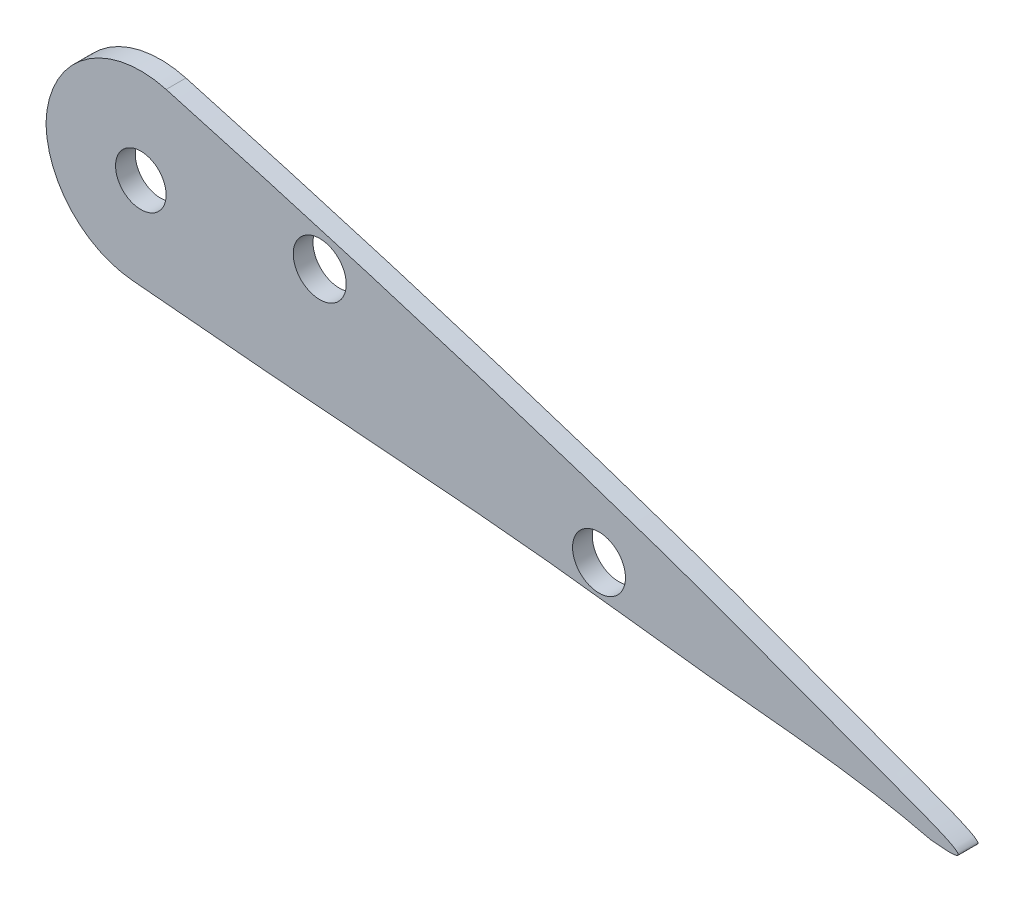
ISO-10303-21;
HEADER;
FILE_DESCRIPTION(('STEP AP214'),'2;1');
FILE_NAME('part.step','',(''),(''),'','','');
FILE_SCHEMA(('AUTOMOTIVE_DESIGN { 1 0 10303 214 1 1 1 1 }'));
ENDSEC;
DATA;
#1=APPLICATION_CONTEXT('core data for automotive mechanical design processes');
#2=APPLICATION_PROTOCOL_DEFINITION('international standard','automotive_design',2000,#1);
#3=PRODUCT_CONTEXT('',#1,'mechanical');
#4=PRODUCT('Part','Part','',(#3));
#5=PRODUCT_RELATED_PRODUCT_CATEGORY('part','',(#4));
#6=PRODUCT_DEFINITION_FORMATION('','',#4);
#7=PRODUCT_DEFINITION_CONTEXT('part definition',#1,'design');
#8=PRODUCT_DEFINITION('design','',#6,#7);
#9=PRODUCT_DEFINITION_SHAPE('','',#8);
#10=(LENGTH_UNIT() NAMED_UNIT(*) SI_UNIT(.MILLI.,.METRE.));
#11=(NAMED_UNIT(*) PLANE_ANGLE_UNIT() SI_UNIT($,.RADIAN.));
#12=(NAMED_UNIT(*) SI_UNIT($,.STERADIAN.) SOLID_ANGLE_UNIT());
#13=UNCERTAINTY_MEASURE_WITH_UNIT(LENGTH_MEASURE(1.E-05),#10,'distance_accuracy_value','');
#14=(GEOMETRIC_REPRESENTATION_CONTEXT(3) GLOBAL_UNCERTAINTY_ASSIGNED_CONTEXT((#13)) GLOBAL_UNIT_ASSIGNED_CONTEXT((#10,
#11,#12)) REPRESENTATION_CONTEXT('',''));
#15=CARTESIAN_POINT('',(0.,0.,0.));
#16=DIRECTION('',(0.,0.,1.));
#17=DIRECTION('',(1.,0.,0.));
#18=AXIS2_PLACEMENT_3D('',#15,#16,#17);
#19=CARTESIAN_POINT('',(0.000560351162113587,0.000130087070423624,1.5875));
#20=CARTESIAN_POINT('',(1.23071418869678,-6.92407609127206,1.5875));
#21=CARTESIAN_POINT('',(15.3166033306834,-6.18906584099094,1.5875));
#22=CARTESIAN_POINT('',(36.4546728163185,-6.09849990105009,1.5875));
#23=CARTESIAN_POINT('',(66.5061971849192,-0.586669106973501,1.5875));
#24=CARTESIAN_POINT('',(110.497331171581,6.18149522271792,1.5875));
#25=CARTESIAN_POINT('',(157.718638091679,9.03065014873911,1.5875));
#26=CARTESIAN_POINT('',(205.10142463584,8.83808028186313,1.5875));
#27=CARTESIAN_POINT('',(235.858814759408,7.87030619247826,1.5875));
#28=CARTESIAN_POINT('',(260.846344817159,5.42741339404395,1.5875));
#29=CARTESIAN_POINT('',(276.264022989737,4.51435670375389,1.5875));
#30=CARTESIAN_POINT('',(293.989507544058,2.09398731346533,1.5875));
#31=CARTESIAN_POINT('',(303.956832564589,1.47095520994628,1.5875));
#32=CARTESIAN_POINT('',(309.846313894505,0.000130087070423666,1.5875));
#33=B_SPLINE_CURVE_WITH_KNOTS('',3,(#19,#20,#21,#22,#23,#24,#25,#26,#27,#28,#29,#30,#31,#32),
.UNSPECIFIED.,.F.,.F.,(4,1,1,1,1,1,1,1,1,1,1,4),(0.,0.0569078595717698,0.106482711504673,
0.214488052979465,0.341297688349143,0.535095665520157,0.664680853556909,0.794660698192775,
0.828978881532905,0.904725108725214,0.942212919019968,1.),.UNSPECIFIED.);
#34=DIRECTION('',(0.,0.,-1.));
#35=VECTOR('',#34,1.);
#36=SURFACE_OF_LINEAR_EXTRUSION('',#33,#35);
#37=CARTESIAN_POINT('',(245.711534403114,6.85589995201886,1.5875));
#38=VERTEX_POINT('',#37);
#39=CARTESIAN_POINT('',(309.846313894505,0.000130087070423864,1.5875));
#40=VERTEX_POINT('',#39);
#41=EDGE_CURVE('E83',#38,#40,#33,.T.);
#42=ORIENTED_EDGE('',*,*,#41,.F.);
#43=DIRECTION('',(0.,0.,-1.));
#44=VECTOR('',#43,1.);
#45=CARTESIAN_POINT('',(245.711534403114,6.85589995201886,1.5875));
#46=LINE('',#45,#44);
#47=CARTESIAN_POINT('',(245.711534403114,6.85589995201886,0.));
#48=VERTEX_POINT('',#47);
#49=EDGE_CURVE('E103',#38,#48,#46,.T.);
#50=ORIENTED_EDGE('',*,*,#49,.T.);
#51=CARTESIAN_POINT('',(0.000560351162113587,0.000130087070423624,0.));
#52=CARTESIAN_POINT('',(1.23071418869678,-6.92407609127206,0.));
#53=CARTESIAN_POINT('',(15.3166033306834,-6.18906584099094,0.));
#54=CARTESIAN_POINT('',(36.4546728163185,-6.09849990105009,0.));
#55=CARTESIAN_POINT('',(66.5061971849192,-0.586669106973501,0.));
#56=CARTESIAN_POINT('',(110.497331171581,6.18149522271792,0.));
#57=CARTESIAN_POINT('',(157.718638091679,9.03065014873911,0.));
#58=CARTESIAN_POINT('',(205.10142463584,8.83808028186313,0.));
#59=CARTESIAN_POINT('',(235.858814759408,7.87030619247826,0.));
#60=CARTESIAN_POINT('',(260.846344817159,5.42741339404395,0.));
#61=CARTESIAN_POINT('',(276.264022989737,4.51435670375389,0.));
#62=CARTESIAN_POINT('',(293.989507544058,2.09398731346533,0.));
#63=CARTESIAN_POINT('',(303.956832564589,1.47095520994628,0.));
#64=CARTESIAN_POINT('',(309.846313894505,0.000130087070423666,0.));
#65=B_SPLINE_CURVE_WITH_KNOTS('',3,(#51,#52,#53,#54,#55,#56,#57,#58,#59,#60,#61,#62,#63,#64),
.UNSPECIFIED.,.F.,.F.,(4,1,1,1,1,1,1,1,1,1,1,4),(0.,0.0569078595717698,0.106482711504673,
0.214488052979465,0.341297688349143,0.535095665520157,0.664680853556909,0.794660698192775,
0.828978881532905,0.904725108725214,0.942212919019968,1.),.UNSPECIFIED.);
#66=CARTESIAN_POINT('',(309.846313894505,0.000130087070423864,0.));
#67=VERTEX_POINT('',#66);
#68=EDGE_CURVE('E100',#48,#67,#65,.T.);
#69=ORIENTED_EDGE('',*,*,#68,.T.);
#70=DIRECTION('',(0.,0.,-1.));
#71=VECTOR('',#70,1.);
#72=CARTESIAN_POINT('',(309.846313894505,0.000130087070423864,1.5875));
#73=LINE('',#72,#71);
#74=EDGE_CURVE('E96',#40,#67,#73,.T.);
#75=ORIENTED_EDGE('',*,*,#74,.F.);
#76=EDGE_LOOP('',(#42,#50,#69,#75));
#77=FACE_BOUND('',#76,.T.);
#78=ADVANCED_FACE('F41',(#77),#36,.F.);
#79=CARTESIAN_POINT('',(309.846313894505,0.000130087070423864,1.5875));
#80=CARTESIAN_POINT('',(314.816918223261,-0.51620674157964,1.5875));
#81=CARTESIAN_POINT('',(301.273197720551,4.38282813873556,1.5875));
#82=CARTESIAN_POINT('',(290.359837670022,8.71099439045776,1.5875));
#83=CARTESIAN_POINT('',(256.952064400645,19.5289209482833,1.5875));
#84=CARTESIAN_POINT('',(217.961060472083,29.6129748944238,1.5875));
#85=CARTESIAN_POINT('',(173.256699242147,40.0411042779434,1.5875));
#86=CARTESIAN_POINT('',(131.400792108858,47.8848319151037,1.5875));
#87=CARTESIAN_POINT('',(89.5976184754884,49.290763053775,1.5875));
#88=CARTESIAN_POINT('',(52.1111282710831,42.0692152748914,1.5875));
#89=CARTESIAN_POINT('',(26.2867198183782,29.9751763284633,1.5875));
#90=CARTESIAN_POINT('',(8.64909202481883,17.8566051741579,1.5875));
#91=CARTESIAN_POINT('',(0.810633126632263,7.35919605469637,1.5875));
#92=CARTESIAN_POINT('',(0.000560351162116727,0.000130087070423829,1.5875));
#93=B_SPLINE_CURVE_WITH_KNOTS('',3,(#79,#80,#81,#82,#83,#84,#85,#86,#87,#88,#89,#90,#91,#92),
.UNSPECIFIED.,.F.,.F.,(4,1,1,1,1,1,1,1,1,1,1,4),(0.,0.0239417713693992,0.070244030177139,
0.147561721425381,0.308455887006792,0.442387865106874,0.551517565626309,0.687091076796298,
0.811391258419108,0.886311735305172,0.939136382225768,1.),.UNSPECIFIED.);
#94=DIRECTION('',(0.,0.,-1.));
#95=VECTOR('',#94,1.);
#96=SURFACE_OF_LINEAR_EXTRUSION('',#93,#95);
#97=CARTESIAN_POINT('',(309.846313894505,0.000130087070423864,0.));
#98=CARTESIAN_POINT('',(314.816918223261,-0.51620674157964,0.));
#99=CARTESIAN_POINT('',(301.273197720551,4.38282813873556,0.));
#100=CARTESIAN_POINT('',(290.359837670022,8.71099439045776,0.));
#101=CARTESIAN_POINT('',(256.952064400645,19.5289209482833,0.));
#102=CARTESIAN_POINT('',(217.961060472083,29.6129748944238,0.));
#103=CARTESIAN_POINT('',(173.256699242147,40.0411042779434,0.));
#104=CARTESIAN_POINT('',(131.400792108858,47.8848319151037,0.));
#105=CARTESIAN_POINT('',(89.5976184754884,49.290763053775,0.));
#106=CARTESIAN_POINT('',(52.1111282710831,42.0692152748914,0.));
#107=CARTESIAN_POINT('',(26.2867198183782,29.9751763284633,0.));
#108=CARTESIAN_POINT('',(8.64909202481883,17.8566051741579,0.));
#109=CARTESIAN_POINT('',(0.810633126632263,7.35919605469637,0.));
#110=CARTESIAN_POINT('',(0.000560351162116727,0.000130087070423829,0.));
#111=B_SPLINE_CURVE_WITH_KNOTS('',3,(#97,#98,#99,#100,#101,#102,#103,#104,#105,#106,#107,#108,
#109,#110),.UNSPECIFIED.,.F.,.F.,(4,1,1,1,1,1,1,1,1,1,1,4),(0.,0.0239417713693992,
0.070244030177139,0.147561721425381,0.308455887006792,0.442387865106874,0.551517565626309,
0.687091076796298,0.811391258419108,0.886311735305172,0.939136382225768,1.),.UNSPECIFIED.);
#112=CARTESIAN_POINT('',(248.380487069027,21.5064277653464,0.));
#113=VERTEX_POINT('',#112);
#114=EDGE_CURVE('E92',#67,#113,#111,.T.);
#115=ORIENTED_EDGE('',*,*,#114,.T.);
#116=DIRECTION('',(0.,0.,-1.));
#117=VECTOR('',#116,1.);
#118=CARTESIAN_POINT('',(248.380487069024,21.5064277653472,0.));
#119=LINE('',#118,#117);
#120=CARTESIAN_POINT('',(248.380487069024,21.5064277653472,1.5875));
#121=VERTEX_POINT('',#120);
#122=EDGE_CURVE('E11',#113,#121,#119,.F.);
#123=ORIENTED_EDGE('',*,*,#122,.T.);
#124=EDGE_CURVE('E85',#40,#121,#93,.T.);
#125=ORIENTED_EDGE('',*,*,#124,.F.);
#126=ORIENTED_EDGE('',*,*,#74,.T.);
#127=EDGE_LOOP('',(#115,#123,#125,#126));
#128=FACE_BOUND('',#127,.T.);
#129=ADVANCED_FACE('F95',(#128),#96,.F.);
#130=CARTESIAN_POINT('',(153.387816973495,8.33338198857885,1.5875));
#131=DIRECTION('',(0.,0.,-1.));
#132=DIRECTION('',(-1.,0.,0.));
#133=AXIS2_PLACEMENT_3D('',#130,#131,#132);
#134=PLANE('',#133);
#135=CARTESIAN_POINT('',(260.720225154827,15.1781728449798,1.5875));
#136=DIRECTION('',(0.,0.,1.));
#137=DIRECTION('',(1.,0.,0.));
#138=AXIS2_PLACEMENT_3D('',#135,#136,#137);
#139=CIRCLE('',#138,2.12700000000001);
#140=CARTESIAN_POINT('',(262.847225154827,15.1781728449798,1.5875));
#141=VERTEX_POINT('',#140);
#142=EDGE_CURVE('E133',#141,#141,#139,.T.);
#143=ORIENTED_EDGE('',*,*,#142,.F.);
#144=EDGE_LOOP('',(#143));
#145=FACE_BOUND('',#144,.T.);
#146=CARTESIAN_POINT('',(283.157187456126,5.97779813190158,1.5875));
#147=DIRECTION('',(0.,0.,1.));
#148=DIRECTION('',(1.,0.,0.));
#149=AXIS2_PLACEMENT_3D('',#146,#147,#148);
#150=CIRCLE('',#149,2.12700000000001);
#151=CARTESIAN_POINT('',(285.284187456126,5.97779813190158,1.5875));
#152=VERTEX_POINT('',#151);
#153=EDGE_CURVE('E140',#152,#152,#150,.T.);
#154=ORIENTED_EDGE('',*,*,#153,.F.);
#155=EDGE_LOOP('',(#154));
#156=FACE_BOUND('',#155,.T.);
#157=CARTESIAN_POINT('',(246.346313894504,14.1629585922611,1.5875));
#158=DIRECTION('',(0.,0.,1.));
#159=DIRECTION('',(1.,0.,0.));
#160=AXIS2_PLACEMENT_3D('',#157,#158,#159);
#161=CIRCLE('',#160,2.03200000000001);
#162=CARTESIAN_POINT('',(248.378313894504,14.1629585922611,1.5875));
#163=VERTEX_POINT('',#162);
#164=EDGE_CURVE('E129',#163,#163,#161,.T.);
#165=ORIENTED_EDGE('',*,*,#164,.F.);
#166=EDGE_LOOP('',(#165));
#167=FACE_BOUND('',#166,.T.);
#168=CARTESIAN_POINT('',(246.346313894504,14.1629585922611,1.5875));
#169=DIRECTION('',(0.,0.,-1.));
#170=DIRECTION('',(-1.,0.,0.));
#171=AXIS2_PLACEMENT_3D('',#168,#169,#170);
#172=CIRCLE('',#171,7.62);
#173=CARTESIAN_POINT('',(238.727660087532,14.3061862763922,1.5875));
#174=VERTEX_POINT('',#173);
#175=EDGE_CURVE('E59',#121,#174,#172,.F.);
#176=ORIENTED_EDGE('',*,*,#175,.T.);
#177=CARTESIAN_POINT('',(246.346313894505,14.4494139605205,1.5875));
#178=DIRECTION('',(0.,0.,-1.));
#179=DIRECTION('',(-1.,0.,0.));
#180=AXIS2_PLACEMENT_3D('',#177,#178,#179);
#181=CIRCLE('',#180,7.62);
#182=EDGE_CURVE('E51',#174,#38,#181,.F.);
#183=ORIENTED_EDGE('',*,*,#182,.T.);
#184=ORIENTED_EDGE('',*,*,#41,.T.);
#185=ORIENTED_EDGE('',*,*,#124,.T.);
#186=EDGE_LOOP('',(#176,#183,#184,#185));
#187=FACE_BOUND('',#186,.T.);
#188=ADVANCED_FACE('F84',(#145,#156,#167,#187),#134,.F.);
#189=CARTESIAN_POINT('',(153.387816973495,8.33338198857885,0.));
#190=DIRECTION('',(0.,0.,-1.));
#191=DIRECTION('',(-1.,0.,0.));
#192=AXIS2_PLACEMENT_3D('',#189,#190,#191);
#193=PLANE('',#192);
#194=CARTESIAN_POINT('',(260.720225154827,15.1781728449798,0.));
#195=DIRECTION('',(0.,0.,-1.));
#196=DIRECTION('',(-1.,0.,0.));
#197=AXIS2_PLACEMENT_3D('',#194,#195,#196);
#198=CIRCLE('',#197,2.12700000000001);
#199=CARTESIAN_POINT('',(258.593225154827,15.1781728449798,0.));
#200=VERTEX_POINT('',#199);
#201=EDGE_CURVE('E45',#200,#200,#198,.T.);
#202=ORIENTED_EDGE('',*,*,#201,.F.);
#203=EDGE_LOOP('',(#202));
#204=FACE_BOUND('',#203,.T.);
#205=CARTESIAN_POINT('',(283.157187456126,5.97779813190158,0.));
#206=DIRECTION('',(0.,0.,-1.));
#207=DIRECTION('',(-1.,0.,0.));
#208=AXIS2_PLACEMENT_3D('',#205,#206,#207);
#209=CIRCLE('',#208,2.12700000000001);
#210=CARTESIAN_POINT('',(281.030187456126,5.97779813190158,0.));
#211=VERTEX_POINT('',#210);
#212=EDGE_CURVE('E130',#211,#211,#209,.T.);
#213=ORIENTED_EDGE('',*,*,#212,.F.);
#214=EDGE_LOOP('',(#213));
#215=FACE_BOUND('',#214,.T.);
#216=CARTESIAN_POINT('',(246.346313894504,14.1629585922611,0.));
#217=DIRECTION('',(0.,0.,-1.));
#218=DIRECTION('',(-1.,0.,0.));
#219=AXIS2_PLACEMENT_3D('',#216,#217,#218);
#220=CIRCLE('',#219,2.03200000000001);
#221=CARTESIAN_POINT('',(244.314313894504,14.1629585922611,0.));
#222=VERTEX_POINT('',#221);
#223=EDGE_CURVE('E126',#222,#222,#220,.T.);
#224=ORIENTED_EDGE('',*,*,#223,.F.);
#225=EDGE_LOOP('',(#224));
#226=FACE_BOUND('',#225,.T.);
#227=ORIENTED_EDGE('',*,*,#68,.F.);
#228=CARTESIAN_POINT('',(246.346313894505,14.4494139605205,0.));
#229=DIRECTION('',(0.,0.,-1.));
#230=DIRECTION('',(-1.,0.,0.));
#231=AXIS2_PLACEMENT_3D('',#228,#229,#230);
#232=CIRCLE('',#231,7.62);
#233=CARTESIAN_POINT('',(238.727660087532,14.3061862763922,0.));
#234=VERTEX_POINT('',#233);
#235=EDGE_CURVE('E115',#48,#234,#232,.T.);
#236=ORIENTED_EDGE('',*,*,#235,.T.);
#237=CARTESIAN_POINT('',(246.346313894504,14.1629585922611,0.));
#238=DIRECTION('',(0.,0.,-1.));
#239=DIRECTION('',(-1.,0.,0.));
#240=AXIS2_PLACEMENT_3D('',#237,#238,#239);
#241=CIRCLE('',#240,7.62);
#242=EDGE_CURVE('E106',#234,#113,#241,.T.);
#243=ORIENTED_EDGE('',*,*,#242,.T.);
#244=ORIENTED_EDGE('',*,*,#114,.F.);
#245=EDGE_LOOP('',(#227,#236,#243,#244));
#246=FACE_BOUND('',#245,.T.);
#247=ADVANCED_FACE('F174',(#204,#215,#226,#246),#193,.T.);
#248=CARTESIAN_POINT('',(246.346313894504,14.1629585922611,0.79375));
#249=DIRECTION('',(0.,0.,-1.));
#250=DIRECTION('',(-1.,0.,0.));
#251=AXIS2_PLACEMENT_3D('',#248,#249,#250);
#252=CYLINDRICAL_SURFACE('',#251,7.62);
#253=DIRECTION('',(0.,0.,-1.));
#254=VECTOR('',#253,1.);
#255=CARTESIAN_POINT('',(238.727660087532,14.3061862763922,0.79375));
#256=LINE('',#255,#254);
#257=EDGE_CURVE('E122',#174,#234,#256,.T.);
#258=ORIENTED_EDGE('',*,*,#257,.F.);
#259=ORIENTED_EDGE('',*,*,#175,.F.);
#260=ORIENTED_EDGE('',*,*,#122,.F.);
#261=ORIENTED_EDGE('',*,*,#242,.F.);
#262=EDGE_LOOP('',(#258,#259,#260,#261));
#263=FACE_BOUND('',#262,.T.);
#264=ADVANCED_FACE('F43',(#263),#252,.T.);
#265=CARTESIAN_POINT('',(246.346313894505,14.4494139605205,0.79375));
#266=DIRECTION('',(0.,0.,-1.));
#267=DIRECTION('',(-1.,0.,0.));
#268=AXIS2_PLACEMENT_3D('',#265,#266,#267);
#269=CYLINDRICAL_SURFACE('',#268,7.62);
#270=ORIENTED_EDGE('',*,*,#182,.F.);
#271=ORIENTED_EDGE('',*,*,#257,.T.);
#272=ORIENTED_EDGE('',*,*,#235,.F.);
#273=ORIENTED_EDGE('',*,*,#49,.F.);
#274=EDGE_LOOP('',(#270,#271,#272,#273));
#275=FACE_BOUND('',#274,.T.);
#276=ADVANCED_FACE('F163',(#275),#269,.T.);
#277=CARTESIAN_POINT('',(246.346313894504,14.1629585922611,-0.9525));
#278=DIRECTION('',(0.,0.,1.));
#279=DIRECTION('',(1.,0.,0.));
#280=AXIS2_PLACEMENT_3D('',#277,#278,#279);
#281=CYLINDRICAL_SURFACE('',#280,2.03200000000001);
#282=ORIENTED_EDGE('',*,*,#223,.T.);
#283=EDGE_LOOP('',(#282));
#284=FACE_BOUND('',#283,.T.);
#285=ORIENTED_EDGE('',*,*,#164,.T.);
#286=EDGE_LOOP('',(#285));
#287=FACE_BOUND('',#286,.T.);
#288=ADVANCED_FACE('F165',(#284,#287),#281,.F.);
#289=CARTESIAN_POINT('',(283.157187456126,5.97779813190158,-0.9525));
#290=DIRECTION('',(0.,0.,1.));
#291=DIRECTION('',(1.,0.,0.));
#292=AXIS2_PLACEMENT_3D('',#289,#290,#291);
#293=CYLINDRICAL_SURFACE('',#292,2.12700000000001);
#294=ORIENTED_EDGE('',*,*,#212,.T.);
#295=EDGE_LOOP('',(#294));
#296=FACE_BOUND('',#295,.T.);
#297=ORIENTED_EDGE('',*,*,#153,.T.);
#298=EDGE_LOOP('',(#297));
#299=FACE_BOUND('',#298,.T.);
#300=ADVANCED_FACE('F171',(#296,#299),#293,.F.);
#301=CARTESIAN_POINT('',(260.720225154827,15.1781728449798,-0.9525));
#302=DIRECTION('',(0.,0.,1.));
#303=DIRECTION('',(1.,0.,0.));
#304=AXIS2_PLACEMENT_3D('',#301,#302,#303);
#305=CYLINDRICAL_SURFACE('',#304,2.12700000000001);
#306=ORIENTED_EDGE('',*,*,#201,.T.);
#307=EDGE_LOOP('',(#306));
#308=FACE_BOUND('',#307,.T.);
#309=ORIENTED_EDGE('',*,*,#142,.T.);
#310=EDGE_LOOP('',(#309));
#311=FACE_BOUND('',#310,.T.);
#312=ADVANCED_FACE('F197',(#308,#311),#305,.F.);
#313=CLOSED_SHELL('',(#78,#129,#188,#247,#264,#276,#288,#300,#312));
#314=MANIFOLD_SOLID_BREP('B2',#313);
#315=ADVANCED_BREP_SHAPE_REPRESENTATION('',(#18,#314),#14);
#316=SHAPE_DEFINITION_REPRESENTATION(#9,#315);
ENDSEC;
END-ISO-10303-21;
